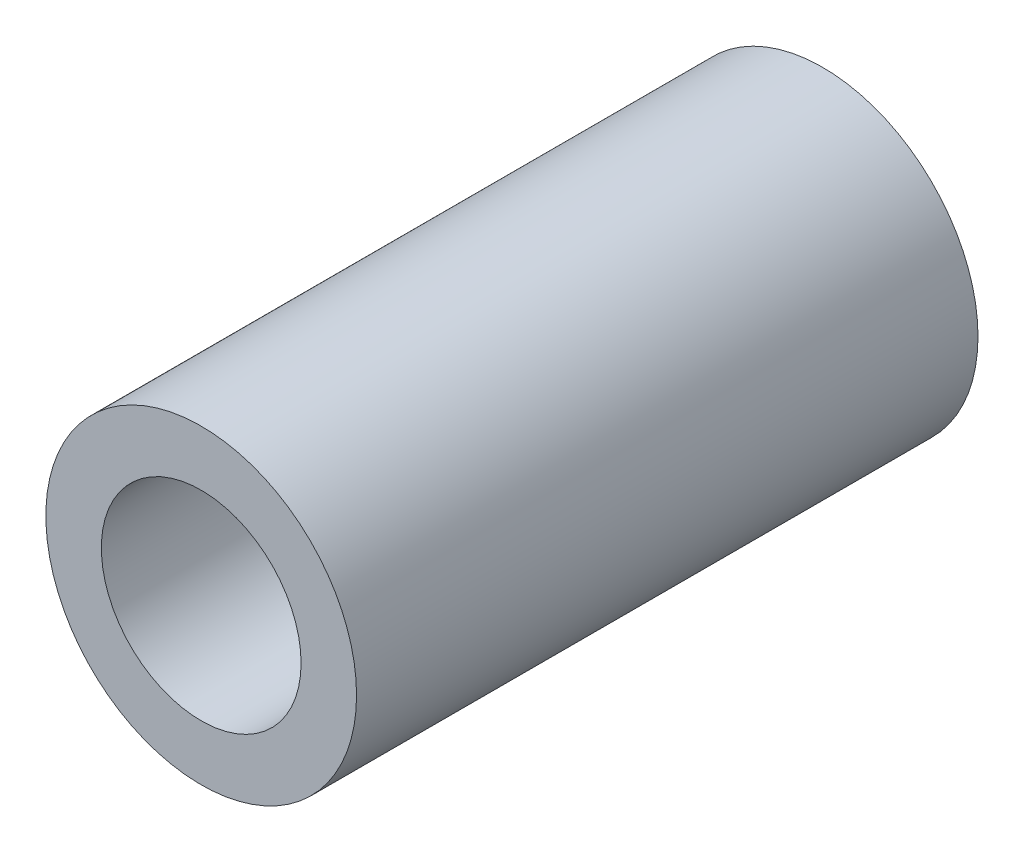
ISO-10303-21;
HEADER;
FILE_DESCRIPTION(('STEP AP214'),'2;1');
FILE_NAME('part.step','',(''),(''),'','','');
FILE_SCHEMA(('AUTOMOTIVE_DESIGN { 1 0 10303 214 1 1 1 1 }'));
ENDSEC;
DATA;
#1=APPLICATION_CONTEXT('core data for automotive mechanical design processes');
#2=APPLICATION_PROTOCOL_DEFINITION('international standard','automotive_design',2000,#1);
#3=PRODUCT_CONTEXT('',#1,'mechanical');
#4=PRODUCT('Part','Part','',(#3));
#5=PRODUCT_RELATED_PRODUCT_CATEGORY('part','',(#4));
#6=PRODUCT_DEFINITION_FORMATION('','',#4);
#7=PRODUCT_DEFINITION_CONTEXT('part definition',#1,'design');
#8=PRODUCT_DEFINITION('design','',#6,#7);
#9=PRODUCT_DEFINITION_SHAPE('','',#8);
#10=(LENGTH_UNIT() NAMED_UNIT(*) SI_UNIT(.MILLI.,.METRE.));
#11=(NAMED_UNIT(*) PLANE_ANGLE_UNIT() SI_UNIT($,.RADIAN.));
#12=(NAMED_UNIT(*) SI_UNIT($,.STERADIAN.) SOLID_ANGLE_UNIT());
#13=UNCERTAINTY_MEASURE_WITH_UNIT(LENGTH_MEASURE(1.E-05),#10,'distance_accuracy_value','');
#14=(GEOMETRIC_REPRESENTATION_CONTEXT(3) GLOBAL_UNCERTAINTY_ASSIGNED_CONTEXT((#13)) GLOBAL_UNIT_ASSIGNED_CONTEXT((#10,
#11,#12)) REPRESENTATION_CONTEXT('',''));
#15=CARTESIAN_POINT('',(0.,0.,0.));
#16=DIRECTION('',(0.,0.,1.));
#17=DIRECTION('',(1.,0.,0.));
#18=AXIS2_PLACEMENT_3D('',#15,#16,#17);
#19=CARTESIAN_POINT('',(0.,0.,28.));
#20=DIRECTION('',(0.,0.,1.));
#21=DIRECTION('',(1.,0.,0.));
#22=AXIS2_PLACEMENT_3D('',#19,#20,#21);
#23=PLANE('',#22);
#24=CARTESIAN_POINT('',(0.,0.,28.));
#25=DIRECTION('',(0.,0.,1.));
#26=DIRECTION('',(1.,0.,0.));
#27=AXIS2_PLACEMENT_3D('',#24,#25,#26);
#28=CIRCLE('',#27,7.);
#29=CARTESIAN_POINT('',(7.,0.,28.));
#30=VERTEX_POINT('',#29);
#31=EDGE_CURVE('E10',#30,#30,#28,.T.);
#32=ORIENTED_EDGE('',*,*,#31,.T.);
#33=EDGE_LOOP('',(#32));
#34=FACE_BOUND('',#33,.T.);
#35=CARTESIAN_POINT('',(0.,0.,28.));
#36=DIRECTION('',(0.,0.,1.));
#37=DIRECTION('',(1.,0.,0.));
#38=AXIS2_PLACEMENT_3D('',#35,#36,#37);
#39=CIRCLE('',#38,4.5);
#40=CARTESIAN_POINT('',(4.5,0.,28.));
#41=VERTEX_POINT('',#40);
#42=EDGE_CURVE('E42',#41,#41,#39,.T.);
#43=ORIENTED_EDGE('',*,*,#42,.F.);
#44=EDGE_LOOP('',(#43));
#45=FACE_BOUND('',#44,.T.);
#46=ADVANCED_FACE('F31',(#34,#45),#23,.T.);
#47=CARTESIAN_POINT('',(0.,0.,0.));
#48=DIRECTION('',(0.,0.,1.));
#49=DIRECTION('',(1.,0.,0.));
#50=AXIS2_PLACEMENT_3D('',#47,#48,#49);
#51=PLANE('',#50);
#52=CARTESIAN_POINT('',(0.,0.,0.));
#53=DIRECTION('',(0.,0.,1.));
#54=DIRECTION('',(1.,0.,0.));
#55=AXIS2_PLACEMENT_3D('',#52,#53,#54);
#56=CIRCLE('',#55,7.);
#57=CARTESIAN_POINT('',(7.,0.,0.));
#58=VERTEX_POINT('',#57);
#59=EDGE_CURVE('E35',#58,#58,#56,.T.);
#60=ORIENTED_EDGE('',*,*,#59,.F.);
#61=EDGE_LOOP('',(#60));
#62=FACE_BOUND('',#61,.T.);
#63=CARTESIAN_POINT('',(0.,0.,0.));
#64=DIRECTION('',(0.,0.,1.));
#65=DIRECTION('',(1.,0.,0.));
#66=AXIS2_PLACEMENT_3D('',#63,#64,#65);
#67=CIRCLE('',#66,4.5);
#68=CARTESIAN_POINT('',(4.5,0.,0.));
#69=VERTEX_POINT('',#68);
#70=EDGE_CURVE('E44',#69,#69,#67,.T.);
#71=ORIENTED_EDGE('',*,*,#70,.T.);
#72=EDGE_LOOP('',(#71));
#73=FACE_BOUND('',#72,.T.);
#74=ADVANCED_FACE('F54',(#62,#73),#51,.F.);
#75=CARTESIAN_POINT('',(0.,0.,28.));
#76=DIRECTION('',(0.,0.,-1.));
#77=DIRECTION('',(-1.,0.,0.));
#78=AXIS2_PLACEMENT_3D('',#75,#76,#77);
#79=CYLINDRICAL_SURFACE('',#78,7.);
#80=ORIENTED_EDGE('',*,*,#31,.F.);
#81=EDGE_LOOP('',(#80));
#82=FACE_BOUND('',#81,.T.);
#83=ORIENTED_EDGE('',*,*,#59,.T.);
#84=EDGE_LOOP('',(#83));
#85=FACE_BOUND('',#84,.T.);
#86=ADVANCED_FACE('F33',(#82,#85),#79,.T.);
#87=CARTESIAN_POINT('',(0.,0.,28.));
#88=DIRECTION('',(0.,0.,-1.));
#89=DIRECTION('',(-1.,0.,0.));
#90=AXIS2_PLACEMENT_3D('',#87,#88,#89);
#91=CYLINDRICAL_SURFACE('',#90,4.5);
#92=ORIENTED_EDGE('',*,*,#42,.T.);
#93=EDGE_LOOP('',(#92));
#94=FACE_BOUND('',#93,.T.);
#95=ORIENTED_EDGE('',*,*,#70,.F.);
#96=EDGE_LOOP('',(#95));
#97=FACE_BOUND('',#96,.T.);
#98=ADVANCED_FACE('F50',(#94,#97),#91,.F.);
#99=CLOSED_SHELL('',(#46,#74,#86,#98));
#100=MANIFOLD_SOLID_BREP('B2',#99);
#101=ADVANCED_BREP_SHAPE_REPRESENTATION('',(#18,#100),#14);
#102=SHAPE_DEFINITION_REPRESENTATION(#9,#101);
ENDSEC;
END-ISO-10303-21;
